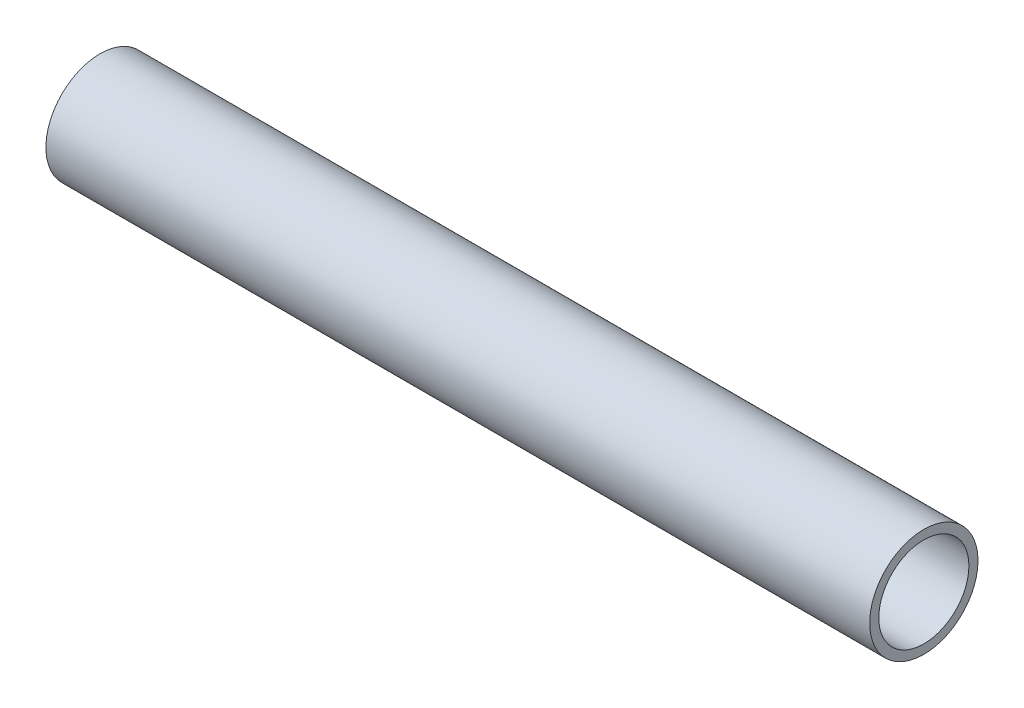
ISO-10303-21;
HEADER;
FILE_DESCRIPTION(('STEP AP214'),'2;1');
FILE_NAME('part.step','',(''),(''),'','','');
FILE_SCHEMA(('AUTOMOTIVE_DESIGN { 1 0 10303 214 1 1 1 1 }'));
ENDSEC;
DATA;
#1=APPLICATION_CONTEXT('core data for automotive mechanical design processes');
#2=APPLICATION_PROTOCOL_DEFINITION('international standard','automotive_design',2000,#1);
#3=PRODUCT_CONTEXT('',#1,'mechanical');
#4=PRODUCT('Part','Part','',(#3));
#5=PRODUCT_RELATED_PRODUCT_CATEGORY('part','',(#4));
#6=PRODUCT_DEFINITION_FORMATION('','',#4);
#7=PRODUCT_DEFINITION_CONTEXT('part definition',#1,'design');
#8=PRODUCT_DEFINITION('design','',#6,#7);
#9=PRODUCT_DEFINITION_SHAPE('','',#8);
#10=(LENGTH_UNIT() NAMED_UNIT(*) SI_UNIT(.MILLI.,.METRE.));
#11=(NAMED_UNIT(*) PLANE_ANGLE_UNIT() SI_UNIT($,.RADIAN.));
#12=(NAMED_UNIT(*) SI_UNIT($,.STERADIAN.) SOLID_ANGLE_UNIT());
#13=UNCERTAINTY_MEASURE_WITH_UNIT(LENGTH_MEASURE(1.E-05),#10,'distance_accuracy_value','');
#14=(GEOMETRIC_REPRESENTATION_CONTEXT(3) GLOBAL_UNCERTAINTY_ASSIGNED_CONTEXT((#13)) GLOBAL_UNIT_ASSIGNED_CONTEXT((#10,
#11,#12)) REPRESENTATION_CONTEXT('',''));
#15=CARTESIAN_POINT('',(0.,0.,0.));
#16=DIRECTION('',(0.,0.,1.));
#17=DIRECTION('',(1.,0.,0.));
#18=AXIS2_PLACEMENT_3D('',#15,#16,#17);
#19=CARTESIAN_POINT('',(-38.7684270759191,1471.85967450443,0.));
#20=DIRECTION('',(-1.,0.,0.));
#21=DIRECTION('',(0.,0.,1.));
#22=AXIS2_PLACEMENT_3D('',#19,#20,#21);
#23=CYLINDRICAL_SURFACE('',#22,5.28319999999993);
#24=CARTESIAN_POINT('',(-38.7684270759191,1471.85967450443,0.));
#25=DIRECTION('',(1.,0.,0.));
#26=DIRECTION('',(0.,0.,-1.));
#27=AXIS2_PLACEMENT_3D('',#24,#25,#26);
#28=CIRCLE('',#27,5.28319999999993);
#29=CARTESIAN_POINT('',(-38.7684270759191,1471.85967450443,-5.28319999999993));
#30=VERTEX_POINT('',#29);
#31=EDGE_CURVE('E45',#30,#30,#28,.T.);
#32=ORIENTED_EDGE('',*,*,#31,.T.);
#33=EDGE_LOOP('',(#32));
#34=FACE_BOUND('',#33,.T.);
#35=CARTESIAN_POINT('',(-135.350259128878,1471.85967450443,0.));
#36=DIRECTION('',(1.,0.,0.));
#37=DIRECTION('',(0.,0.,-1.));
#38=AXIS2_PLACEMENT_3D('',#35,#36,#37);
#39=CIRCLE('',#38,5.28319999999993);
#40=CARTESIAN_POINT('',(-135.350259128878,1471.85967450443,-5.28319999999993));
#41=VERTEX_POINT('',#40);
#42=EDGE_CURVE('E51',#41,#41,#39,.T.);
#43=ORIENTED_EDGE('',*,*,#42,.F.);
#44=EDGE_LOOP('',(#43));
#45=FACE_BOUND('',#44,.T.);
#46=ADVANCED_FACE('F38',(#34,#45),#23,.F.);
#47=CARTESIAN_POINT('',(-38.7684270759191,1471.85967450443,0.));
#48=DIRECTION('',(-1.,0.,0.));
#49=DIRECTION('',(0.,0.,1.));
#50=AXIS2_PLACEMENT_3D('',#47,#48,#49);
#51=CYLINDRICAL_SURFACE('',#50,6.34999999999994);
#52=CARTESIAN_POINT('',(-38.7684270759191,1471.85967450443,0.));
#53=DIRECTION('',(1.,0.,0.));
#54=DIRECTION('',(0.,0.,-1.));
#55=AXIS2_PLACEMENT_3D('',#52,#53,#54);
#56=CIRCLE('',#55,6.34999999999994);
#57=CARTESIAN_POINT('',(-38.7684270759191,1471.85967450443,-6.34999999999994));
#58=VERTEX_POINT('',#57);
#59=EDGE_CURVE('E11',#58,#58,#56,.T.);
#60=ORIENTED_EDGE('',*,*,#59,.F.);
#61=EDGE_LOOP('',(#60));
#62=FACE_BOUND('',#61,.T.);
#63=CARTESIAN_POINT('',(-135.350259128878,1471.85967450443,0.));
#64=DIRECTION('',(1.,0.,0.));
#65=DIRECTION('',(0.,0.,-1.));
#66=AXIS2_PLACEMENT_3D('',#63,#64,#65);
#67=CIRCLE('',#66,6.34999999999994);
#68=CARTESIAN_POINT('',(-135.350259128878,1471.85967450443,-6.34999999999994));
#69=VERTEX_POINT('',#68);
#70=EDGE_CURVE('E41',#69,#69,#67,.T.);
#71=ORIENTED_EDGE('',*,*,#70,.T.);
#72=EDGE_LOOP('',(#71));
#73=FACE_BOUND('',#72,.T.);
#74=ADVANCED_FACE('F58',(#62,#73),#51,.T.);
#75=CARTESIAN_POINT('',(-38.7684270759191,1471.85967450443,0.));
#76=DIRECTION('',(1.,0.,0.));
#77=DIRECTION('',(0.,0.,-1.));
#78=AXIS2_PLACEMENT_3D('',#75,#76,#77);
#79=PLANE('',#78);
#80=ORIENTED_EDGE('',*,*,#31,.F.);
#81=EDGE_LOOP('',(#80));
#82=FACE_BOUND('',#81,.T.);
#83=ORIENTED_EDGE('',*,*,#59,.T.);
#84=EDGE_LOOP('',(#83));
#85=FACE_BOUND('',#84,.T.);
#86=ADVANCED_FACE('F62',(#82,#85),#79,.T.);
#87=CARTESIAN_POINT('',(-135.350259128878,1471.85967450443,0.));
#88=DIRECTION('',(1.,0.,0.));
#89=DIRECTION('',(0.,0.,-1.));
#90=AXIS2_PLACEMENT_3D('',#87,#88,#89);
#91=PLANE('',#90);
#92=ORIENTED_EDGE('',*,*,#42,.T.);
#93=EDGE_LOOP('',(#92));
#94=FACE_BOUND('',#93,.T.);
#95=ORIENTED_EDGE('',*,*,#70,.F.);
#96=EDGE_LOOP('',(#95));
#97=FACE_BOUND('',#96,.T.);
#98=ADVANCED_FACE('F60',(#94,#97),#91,.F.);
#99=CLOSED_SHELL('',(#46,#74,#86,#98));
#100=MANIFOLD_SOLID_BREP('B2',#99);
#101=ADVANCED_BREP_SHAPE_REPRESENTATION('',(#18,#100),#14);
#102=SHAPE_DEFINITION_REPRESENTATION(#9,#101);
ENDSEC;
END-ISO-10303-21;
